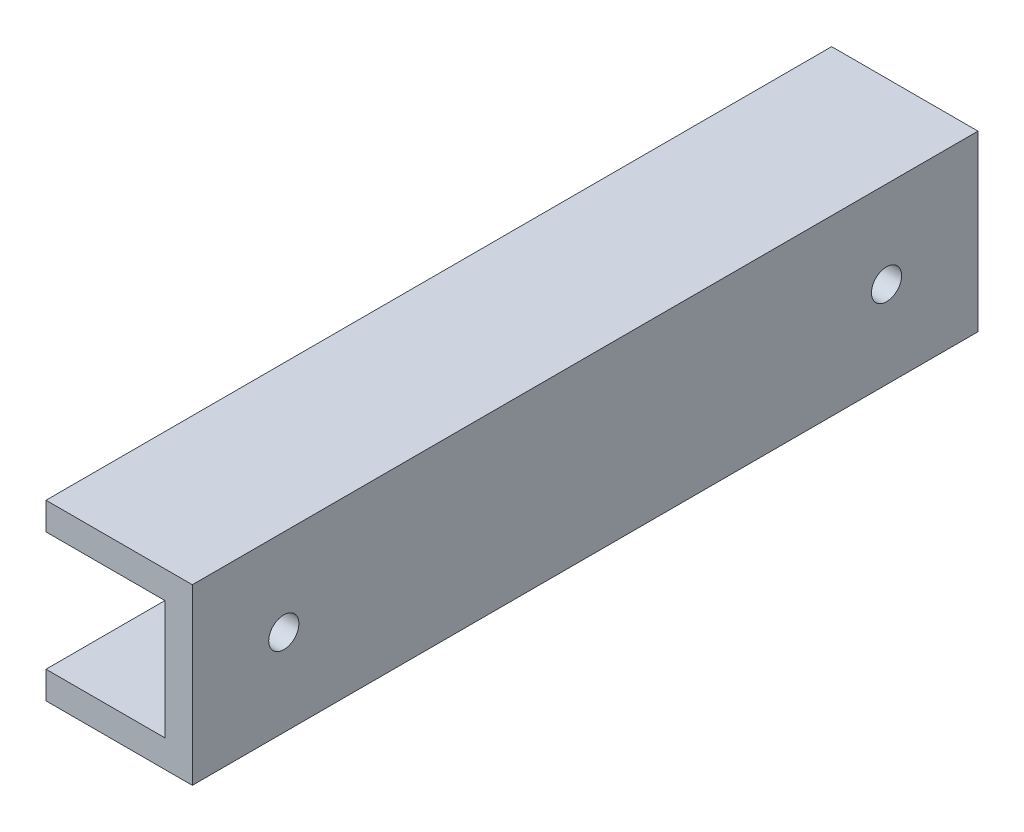
ISO-10303-21;
HEADER;
FILE_DESCRIPTION(('STEP AP214'),'2;1');
FILE_NAME('part.step','',(''),(''),'','','');
FILE_SCHEMA(('AUTOMOTIVE_DESIGN { 1 0 10303 214 1 1 1 1 }'));
ENDSEC;
DATA;
#1=APPLICATION_CONTEXT('core data for automotive mechanical design processes');
#2=APPLICATION_PROTOCOL_DEFINITION('international standard','automotive_design',2000,#1);
#3=PRODUCT_CONTEXT('',#1,'mechanical');
#4=PRODUCT('Part','Part','',(#3));
#5=PRODUCT_RELATED_PRODUCT_CATEGORY('part','',(#4));
#6=PRODUCT_DEFINITION_FORMATION('','',#4);
#7=PRODUCT_DEFINITION_CONTEXT('part definition',#1,'design');
#8=PRODUCT_DEFINITION('design','',#6,#7);
#9=PRODUCT_DEFINITION_SHAPE('','',#8);
#10=(LENGTH_UNIT() NAMED_UNIT(*) SI_UNIT(.MILLI.,.METRE.));
#11=(NAMED_UNIT(*) PLANE_ANGLE_UNIT() SI_UNIT($,.RADIAN.));
#12=(NAMED_UNIT(*) SI_UNIT($,.STERADIAN.) SOLID_ANGLE_UNIT());
#13=UNCERTAINTY_MEASURE_WITH_UNIT(LENGTH_MEASURE(1.E-05),#10,'distance_accuracy_value','');
#14=(GEOMETRIC_REPRESENTATION_CONTEXT(3) GLOBAL_UNCERTAINTY_ASSIGNED_CONTEXT((#13)) GLOBAL_UNIT_ASSIGNED_CONTEXT((#10,
#11,#12)) REPRESENTATION_CONTEXT('',''));
#15=CARTESIAN_POINT('',(0.,0.,0.));
#16=DIRECTION('',(0.,0.,1.));
#17=DIRECTION('',(1.,0.,0.));
#18=AXIS2_PLACEMENT_3D('',#15,#16,#17);
#19=CARTESIAN_POINT('',(3.,13.,23.));
#20=DIRECTION('',(0.,0.,1.));
#21=DIRECTION('',(0.,-1.,0.));
#22=AXIS2_PLACEMENT_3D('',#19,#20,#21);
#23=PLANE('',#22);
#24=DIRECTION('',(1.,0.,0.));
#25=VECTOR('',#24,1.);
#26=CARTESIAN_POINT('',(3.,13.,23.));
#27=LINE('',#26,#25);
#28=CARTESIAN_POINT('',(3.,13.,23.));
#29=VERTEX_POINT('',#28);
#30=CARTESIAN_POINT('',(8.99999999999998,13.,23.));
#31=VERTEX_POINT('',#30);
#32=EDGE_CURVE('E237',#29,#31,#27,.T.);
#33=ORIENTED_EDGE('',*,*,#32,.T.);
#34=DIRECTION('',(0.,-1.,0.));
#35=VECTOR('',#34,1.);
#36=CARTESIAN_POINT('',(8.99999999999998,13.,23.));
#37=LINE('',#36,#35);
#38=CARTESIAN_POINT('',(9.00000000000001,9.,23.));
#39=VERTEX_POINT('',#38);
#40=EDGE_CURVE('E71',#31,#39,#37,.T.);
#41=ORIENTED_EDGE('',*,*,#40,.T.);
#42=DIRECTION('',(-1.,0.,0.));
#43=VECTOR('',#42,1.);
#44=CARTESIAN_POINT('',(6.,9.,23.));
#45=LINE('',#44,#43);
#46=CARTESIAN_POINT('',(3.,9.,23.));
#47=VERTEX_POINT('',#46);
#48=EDGE_CURVE('E352',#39,#47,#45,.T.);
#49=ORIENTED_EDGE('',*,*,#48,.T.);
#50=DIRECTION('',(0.,-1.,0.));
#51=VECTOR('',#50,1.);
#52=CARTESIAN_POINT('',(3.,13.,23.));
#53=LINE('',#52,#51);
#54=EDGE_CURVE('E223',#29,#47,#53,.T.);
#55=ORIENTED_EDGE('',*,*,#54,.F.);
#56=EDGE_LOOP('',(#33,#41,#49,#55));
#57=FACE_BOUND('',#56,.T.);
#58=ADVANCED_FACE('F62',(#57),#23,.F.);
#59=CARTESIAN_POINT('',(3.,13.,62.9));
#60=DIRECTION('',(0.,0.,-1.));
#61=DIRECTION('',(-1.,0.,0.));
#62=AXIS2_PLACEMENT_3D('',#59,#60,#61);
#63=PLANE('',#62);
#64=DIRECTION('',(1.,0.,0.));
#65=VECTOR('',#64,1.);
#66=CARTESIAN_POINT('',(3.,0.,62.9));
#67=LINE('',#66,#65);
#68=CARTESIAN_POINT('',(3.,0.,62.9));
#69=VERTEX_POINT('',#68);
#70=CARTESIAN_POINT('',(8.99999999999998,0.,62.9));
#71=VERTEX_POINT('',#70);
#72=EDGE_CURVE('E224',#69,#71,#67,.T.);
#73=ORIENTED_EDGE('',*,*,#72,.T.);
#74=DIRECTION('',(0.,1.,0.));
#75=VECTOR('',#74,1.);
#76=CARTESIAN_POINT('',(8.99999999999998,13.,62.9));
#77=LINE('',#76,#75);
#78=CARTESIAN_POINT('',(8.99999999999999,4.,62.9));
#79=VERTEX_POINT('',#78);
#80=EDGE_CURVE('E334',#71,#79,#77,.T.);
#81=ORIENTED_EDGE('',*,*,#80,.T.);
#82=DIRECTION('',(-1.,0.,0.));
#83=VECTOR('',#82,1.);
#84=CARTESIAN_POINT('',(6.,4.,62.9));
#85=LINE('',#84,#83);
#86=CARTESIAN_POINT('',(3.,4.,62.9));
#87=VERTEX_POINT('',#86);
#88=EDGE_CURVE('E209',#79,#87,#85,.T.);
#89=ORIENTED_EDGE('',*,*,#88,.T.);
#90=DIRECTION('',(0.,1.,0.));
#91=VECTOR('',#90,1.);
#92=CARTESIAN_POINT('',(3.,13.,62.9));
#93=LINE('',#92,#91);
#94=EDGE_CURVE('E218',#69,#87,#93,.T.);
#95=ORIENTED_EDGE('',*,*,#94,.F.);
#96=EDGE_LOOP('',(#73,#81,#89,#95));
#97=FACE_BOUND('',#96,.T.);
#98=ADVANCED_FACE('F424',(#97),#63,.F.);
#99=CARTESIAN_POINT('',(3.,0.,0.));
#100=DIRECTION('',(-1.,0.,0.));
#101=DIRECTION('',(0.,0.,1.));
#102=AXIS2_PLACEMENT_3D('',#99,#100,#101);
#103=PLANE('',#102);
#104=DIRECTION('',(0.,0.,-1.));
#105=VECTOR('',#104,1.);
#106=CARTESIAN_POINT('',(3.,9.,23.));
#107=LINE('',#106,#105);
#108=CARTESIAN_POINT('',(3.,9.,62.9));
#109=VERTEX_POINT('',#108);
#110=EDGE_CURVE('E219',#109,#47,#107,.T.);
#111=ORIENTED_EDGE('',*,*,#110,.F.);
#112=CARTESIAN_POINT('',(3.,13.,62.9));
#113=VERTEX_POINT('',#112);
#114=EDGE_CURVE('E361',#109,#113,#93,.T.);
#115=ORIENTED_EDGE('',*,*,#114,.T.);
#116=DIRECTION('',(0.,0.,-1.));
#117=VECTOR('',#116,1.);
#118=CARTESIAN_POINT('',(3.,13.,23.));
#119=LINE('',#118,#117);
#120=EDGE_CURVE('E234',#113,#29,#119,.T.);
#121=ORIENTED_EDGE('',*,*,#120,.T.);
#122=ORIENTED_EDGE('',*,*,#54,.T.);
#123=EDGE_LOOP('',(#111,#115,#121,#122));
#124=FACE_BOUND('',#123,.T.);
#125=ADVANCED_FACE('F429',(#124),#103,.T.);
#126=CARTESIAN_POINT('',(0.,0.,85.9));
#127=DIRECTION('',(0.,1.,0.));
#128=DIRECTION('',(0.,0.,1.));
#129=AXIS2_PLACEMENT_3D('',#126,#127,#128);
#130=PLANE('',#129);
#131=DIRECTION('',(0.,0.,-1.));
#132=VECTOR('',#131,1.);
#133=CARTESIAN_POINT('',(13.,0.,85.9));
#134=LINE('',#133,#132);
#135=CARTESIAN_POINT('',(13.,0.,85.9));
#136=VERTEX_POINT('',#135);
#137=CARTESIAN_POINT('',(13.,0.,66.9));
#138=VERTEX_POINT('',#137);
#139=EDGE_CURVE('E285',#136,#138,#134,.T.);
#140=ORIENTED_EDGE('',*,*,#139,.T.);
#141=DIRECTION('',(-0.707106781186551,0.,-0.707106781186544));
#142=VECTOR('',#141,1.);
#143=CARTESIAN_POINT('',(15.9999999999999,0.,69.8999999999999));
#144=LINE('',#143,#142);
#145=EDGE_CURVE('E344',#138,#71,#144,.T.);
#146=ORIENTED_EDGE('',*,*,#145,.T.);
#147=ORIENTED_EDGE('',*,*,#72,.F.);
#148=DIRECTION('',(0.,0.,1.));
#149=VECTOR('',#148,1.);
#150=CARTESIAN_POINT('',(3.,0.,23.));
#151=LINE('',#150,#149);
#152=CARTESIAN_POINT('',(3.,0.,23.));
#153=VERTEX_POINT('',#152);
#154=EDGE_CURVE('E227',#153,#69,#151,.T.);
#155=ORIENTED_EDGE('',*,*,#154,.F.);
#156=DIRECTION('',(1.,0.,0.));
#157=VECTOR('',#156,1.);
#158=CARTESIAN_POINT('',(3.,0.,23.));
#159=LINE('',#158,#157);
#160=CARTESIAN_POINT('',(8.99999999999998,0.,23.));
#161=VERTEX_POINT('',#160);
#162=EDGE_CURVE('E222',#153,#161,#159,.T.);
#163=ORIENTED_EDGE('',*,*,#162,.T.);
#164=DIRECTION('',(0.707106781186551,0.,-0.707106781186544));
#165=VECTOR('',#164,1.);
#166=CARTESIAN_POINT('',(-26.9500000000001,0.,58.9499999999997));
#167=LINE('',#166,#165);
#168=CARTESIAN_POINT('',(13.,0.,19.));
#169=VERTEX_POINT('',#168);
#170=EDGE_CURVE('E78',#161,#169,#167,.T.);
#171=ORIENTED_EDGE('',*,*,#170,.T.);
#172=CARTESIAN_POINT('',(13.,0.,0.));
#173=VERTEX_POINT('',#172);
#174=EDGE_CURVE('E284',#169,#173,#134,.T.);
#175=ORIENTED_EDGE('',*,*,#174,.T.);
#176=DIRECTION('',(1.,0.,0.));
#177=VECTOR('',#176,1.);
#178=CARTESIAN_POINT('',(0.,0.,0.));
#179=LINE('',#178,#177);
#180=CARTESIAN_POINT('',(0.,0.,0.));
#181=VERTEX_POINT('',#180);
#182=EDGE_CURVE('E260',#181,#173,#179,.T.);
#183=ORIENTED_EDGE('',*,*,#182,.F.);
#184=DIRECTION('',(0.,0.,-1.));
#185=VECTOR('',#184,1.);
#186=CARTESIAN_POINT('',(0.,0.,85.9));
#187=LINE('',#186,#185);
#188=CARTESIAN_POINT('',(0.,0.,85.9));
#189=VERTEX_POINT('',#188);
#190=EDGE_CURVE('E288',#189,#181,#187,.T.);
#191=ORIENTED_EDGE('',*,*,#190,.F.);
#192=DIRECTION('',(1.,0.,0.));
#193=VECTOR('',#192,1.);
#194=CARTESIAN_POINT('',(0.,0.,85.9));
#195=LINE('',#194,#193);
#196=EDGE_CURVE('E261',#189,#136,#195,.T.);
#197=ORIENTED_EDGE('',*,*,#196,.T.);
#198=EDGE_LOOP('',(#140,#146,#147,#155,#163,#171,#175,#183,#191,#197));
#199=FACE_BOUND('',#198,.T.);
#200=ADVANCED_FACE('F397',(#199),#130,.T.);
#201=CARTESIAN_POINT('',(13.,0.,85.9));
#202=DIRECTION('',(-1.,0.,0.));
#203=DIRECTION('',(0.,0.,1.));
#204=AXIS2_PLACEMENT_3D('',#201,#202,#203);
#205=PLANE('',#204);
#206=CARTESIAN_POINT('',(13.,6.5,75.9));
#207=DIRECTION('',(-1.,0.,0.));
#208=DIRECTION('',(0.,0.,1.));
#209=AXIS2_PLACEMENT_3D('',#206,#207,#208);
#210=CIRCLE('',#209,1.65);
#211=CARTESIAN_POINT('',(13.,6.5,77.55));
#212=VERTEX_POINT('',#211);
#213=EDGE_CURVE('E248',#212,#212,#210,.T.);
#214=ORIENTED_EDGE('',*,*,#213,.F.);
#215=EDGE_LOOP('',(#214));
#216=FACE_BOUND('',#215,.T.);
#217=DIRECTION('',(0.,0.,-1.));
#218=VECTOR('',#217,1.);
#219=CARTESIAN_POINT('',(13.,13.,85.9));
#220=LINE('',#219,#218);
#221=CARTESIAN_POINT('',(13.,13.,85.9));
#222=VERTEX_POINT('',#221);
#223=CARTESIAN_POINT('',(13.,13.,66.9));
#224=VERTEX_POINT('',#223);
#225=EDGE_CURVE('E281',#222,#224,#220,.T.);
#226=ORIENTED_EDGE('',*,*,#225,.T.);
#227=DIRECTION('',(0.,-1.,0.));
#228=VECTOR('',#227,1.);
#229=CARTESIAN_POINT('',(13.,0.,66.9));
#230=LINE('',#229,#228);
#231=EDGE_CURVE('E341',#224,#138,#230,.T.);
#232=ORIENTED_EDGE('',*,*,#231,.T.);
#233=ORIENTED_EDGE('',*,*,#139,.F.);
#234=DIRECTION('',(0.,1.,0.));
#235=VECTOR('',#234,1.);
#236=CARTESIAN_POINT('',(13.,0.,85.9));
#237=LINE('',#236,#235);
#238=EDGE_CURVE('E263',#136,#222,#237,.T.);
#239=ORIENTED_EDGE('',*,*,#238,.T.);
#240=EDGE_LOOP('',(#226,#232,#233,#239));
#241=FACE_BOUND('',#240,.T.);
#242=ADVANCED_FACE('F395',(#216,#241),#205,.T.);
#243=CARTESIAN_POINT('',(0.,13.,85.9));
#244=DIRECTION('',(0.,-1.,0.));
#245=DIRECTION('',(0.,0.,-1.));
#246=AXIS2_PLACEMENT_3D('',#243,#244,#245);
#247=PLANE('',#246);
#248=DIRECTION('',(1.,0.,0.));
#249=VECTOR('',#248,1.);
#250=CARTESIAN_POINT('',(3.,13.,62.9));
#251=LINE('',#250,#249);
#252=CARTESIAN_POINT('',(8.99999999999998,13.,62.9));
#253=VERTEX_POINT('',#252);
#254=EDGE_CURVE('E229',#113,#253,#251,.T.);
#255=ORIENTED_EDGE('',*,*,#254,.T.);
#256=DIRECTION('',(0.707106781186551,0.,0.707106781186544));
#257=VECTOR('',#256,1.);
#258=CARTESIAN_POINT('',(15.9999999999999,13.,69.8999999999999));
#259=LINE('',#258,#257);
#260=EDGE_CURVE('E339',#253,#224,#259,.T.);
#261=ORIENTED_EDGE('',*,*,#260,.T.);
#262=ORIENTED_EDGE('',*,*,#225,.F.);
#263=DIRECTION('',(-1.,0.,0.));
#264=VECTOR('',#263,1.);
#265=CARTESIAN_POINT('',(0.,13.,85.9));
#266=LINE('',#265,#264);
#267=CARTESIAN_POINT('',(0.,13.,85.9));
#268=VERTEX_POINT('',#267);
#269=EDGE_CURVE('E267',#222,#268,#266,.T.);
#270=ORIENTED_EDGE('',*,*,#269,.T.);
#271=DIRECTION('',(0.,0.,-1.));
#272=VECTOR('',#271,1.);
#273=CARTESIAN_POINT('',(0.,13.,85.9));
#274=LINE('',#273,#272);
#275=CARTESIAN_POINT('',(0.,13.,0.));
#276=VERTEX_POINT('',#275);
#277=EDGE_CURVE('E270',#268,#276,#274,.T.);
#278=ORIENTED_EDGE('',*,*,#277,.T.);
#279=DIRECTION('',(-1.,0.,0.));
#280=VECTOR('',#279,1.);
#281=CARTESIAN_POINT('',(0.,13.,0.));
#282=LINE('',#281,#280);
#283=CARTESIAN_POINT('',(13.,13.,0.));
#284=VERTEX_POINT('',#283);
#285=EDGE_CURVE('E264',#284,#276,#282,.T.);
#286=ORIENTED_EDGE('',*,*,#285,.F.);
#287=CARTESIAN_POINT('',(13.,13.,19.));
#288=VERTEX_POINT('',#287);
#289=EDGE_CURVE('E280',#288,#284,#220,.T.);
#290=ORIENTED_EDGE('',*,*,#289,.F.);
#291=DIRECTION('',(-0.707106781186551,0.,0.707106781186544));
#292=VECTOR('',#291,1.);
#293=CARTESIAN_POINT('',(-26.9500000000001,13.,58.9499999999997));
#294=LINE('',#293,#292);
#295=EDGE_CURVE('E337',#288,#31,#294,.T.);
#296=ORIENTED_EDGE('',*,*,#295,.T.);
#297=ORIENTED_EDGE('',*,*,#32,.F.);
#298=ORIENTED_EDGE('',*,*,#120,.F.);
#299=EDGE_LOOP('',(#255,#261,#262,#270,#278,#286,#290,#296,#297,#298));
#300=FACE_BOUND('',#299,.T.);
#301=ADVANCED_FACE('F384',(#300),#247,.T.);
#302=CARTESIAN_POINT('',(13.,6.5,10.));
#303=DIRECTION('',(-1.,0.,0.));
#304=DIRECTION('',(0.,0.,1.));
#305=AXIS2_PLACEMENT_3D('',#302,#303,#304);
#306=CIRCLE('',#305,1.65);
#307=CARTESIAN_POINT('',(13.,6.5,11.65));
#308=VERTEX_POINT('',#307);
#309=EDGE_CURVE('E256',#308,#308,#306,.T.);
#310=ORIENTED_EDGE('',*,*,#309,.F.);
#311=EDGE_LOOP('',(#310));
#312=FACE_BOUND('',#311,.T.);
#313=ORIENTED_EDGE('',*,*,#174,.F.);
#314=DIRECTION('',(0.,1.,0.));
#315=VECTOR('',#314,1.);
#316=CARTESIAN_POINT('',(13.,0.,19.));
#317=LINE('',#316,#315);
#318=EDGE_CURVE('E12',#169,#288,#317,.T.);
#319=ORIENTED_EDGE('',*,*,#318,.T.);
#320=ORIENTED_EDGE('',*,*,#289,.T.);
#321=DIRECTION('',(0.,1.,0.));
#322=VECTOR('',#321,1.);
#323=CARTESIAN_POINT('',(13.,0.,0.));
#324=LINE('',#323,#322);
#325=EDGE_CURVE('E273',#173,#284,#324,.T.);
#326=ORIENTED_EDGE('',*,*,#325,.F.);
#327=EDGE_LOOP('',(#313,#319,#320,#326));
#328=FACE_BOUND('',#327,.T.);
#329=ADVANCED_FACE('F417',(#312,#328),#205,.T.);
#330=CARTESIAN_POINT('',(0.,0.,85.9));
#331=DIRECTION('',(0.,0.,1.));
#332=DIRECTION('',(1.,0.,0.));
#333=AXIS2_PLACEMENT_3D('',#330,#331,#332);
#334=PLANE('',#333);
#335=DIRECTION('',(-1.,0.,0.));
#336=VECTOR('',#335,1.);
#337=CARTESIAN_POINT('',(0.,16.,85.9));
#338=LINE('',#337,#336);
#339=CARTESIAN_POINT('',(16.,16.,85.9));
#340=VERTEX_POINT('',#339);
#341=CARTESIAN_POINT('',(0.,16.,85.9));
#342=VERTEX_POINT('',#341);
#343=EDGE_CURVE('E296',#340,#342,#338,.T.);
#344=ORIENTED_EDGE('',*,*,#343,.T.);
#345=DIRECTION('',(0.,-1.,0.));
#346=VECTOR('',#345,1.);
#347=CARTESIAN_POINT('',(0.,0.,85.9));
#348=LINE('',#347,#346);
#349=EDGE_CURVE('E244',#342,#268,#348,.T.);
#350=ORIENTED_EDGE('',*,*,#349,.T.);
#351=ORIENTED_EDGE('',*,*,#269,.F.);
#352=ORIENTED_EDGE('',*,*,#238,.F.);
#353=ORIENTED_EDGE('',*,*,#196,.F.);
#354=CARTESIAN_POINT('',(0.,-3.,85.9));
#355=VERTEX_POINT('',#354);
#356=EDGE_CURVE('E249',#189,#355,#348,.T.);
#357=ORIENTED_EDGE('',*,*,#356,.T.);
#358=DIRECTION('',(1.,0.,0.));
#359=VECTOR('',#358,1.);
#360=CARTESIAN_POINT('',(0.,-3.,85.9));
#361=LINE('',#360,#359);
#362=CARTESIAN_POINT('',(16.,-3.,85.9));
#363=VERTEX_POINT('',#362);
#364=EDGE_CURVE('E291',#355,#363,#361,.T.);
#365=ORIENTED_EDGE('',*,*,#364,.T.);
#366=DIRECTION('',(0.,1.,0.));
#367=VECTOR('',#366,1.);
#368=CARTESIAN_POINT('',(16.,0.,85.9));
#369=LINE('',#368,#367);
#370=EDGE_CURVE('E293',#363,#340,#369,.T.);
#371=ORIENTED_EDGE('',*,*,#370,.T.);
#372=EDGE_LOOP('',(#344,#350,#351,#352,#353,#357,#365,#371));
#373=FACE_BOUND('',#372,.T.);
#374=ADVANCED_FACE('F404',(#373),#334,.T.);
#375=CARTESIAN_POINT('',(0.,0.,0.));
#376=DIRECTION('',(0.,0.,1.));
#377=DIRECTION('',(1.,0.,0.));
#378=AXIS2_PLACEMENT_3D('',#375,#376,#377);
#379=PLANE('',#378);
#380=DIRECTION('',(0.,-1.,0.));
#381=VECTOR('',#380,1.);
#382=CARTESIAN_POINT('',(0.,0.,0.));
#383=LINE('',#382,#381);
#384=CARTESIAN_POINT('',(0.,16.,0.));
#385=VERTEX_POINT('',#384);
#386=EDGE_CURVE('E242',#385,#276,#383,.T.);
#387=ORIENTED_EDGE('',*,*,#386,.F.);
#388=DIRECTION('',(-1.,0.,0.));
#389=VECTOR('',#388,1.);
#390=CARTESIAN_POINT('',(0.,16.,0.));
#391=LINE('',#390,#389);
#392=CARTESIAN_POINT('',(16.,16.,0.));
#393=VERTEX_POINT('',#392);
#394=EDGE_CURVE('E294',#393,#385,#391,.T.);
#395=ORIENTED_EDGE('',*,*,#394,.F.);
#396=DIRECTION('',(0.,1.,0.));
#397=VECTOR('',#396,1.);
#398=CARTESIAN_POINT('',(16.,0.,0.));
#399=LINE('',#398,#397);
#400=CARTESIAN_POINT('',(16.,-3.,0.));
#401=VERTEX_POINT('',#400);
#402=EDGE_CURVE('E301',#401,#393,#399,.T.);
#403=ORIENTED_EDGE('',*,*,#402,.F.);
#404=DIRECTION('',(1.,0.,0.));
#405=VECTOR('',#404,1.);
#406=CARTESIAN_POINT('',(0.,-3.,0.));
#407=LINE('',#406,#405);
#408=CARTESIAN_POINT('',(0.,-3.,0.));
#409=VERTEX_POINT('',#408);
#410=EDGE_CURVE('E290',#409,#401,#407,.T.);
#411=ORIENTED_EDGE('',*,*,#410,.F.);
#412=EDGE_CURVE('E241',#181,#409,#383,.T.);
#413=ORIENTED_EDGE('',*,*,#412,.F.);
#414=ORIENTED_EDGE('',*,*,#182,.T.);
#415=ORIENTED_EDGE('',*,*,#325,.T.);
#416=ORIENTED_EDGE('',*,*,#285,.T.);
#417=EDGE_LOOP('',(#387,#395,#403,#411,#413,#414,#415,#416));
#418=FACE_BOUND('',#417,.T.);
#419=ADVANCED_FACE('F412',(#418),#379,.F.);
#420=CARTESIAN_POINT('',(0.,-3.,85.9));
#421=DIRECTION('',(0.,1.,0.));
#422=DIRECTION('',(0.,0.,1.));
#423=AXIS2_PLACEMENT_3D('',#420,#421,#422);
#424=PLANE('',#423);
#425=DIRECTION('',(0.,0.,1.));
#426=VECTOR('',#425,1.);
#427=CARTESIAN_POINT('',(0.,-3.,85.9));
#428=LINE('',#427,#426);
#429=EDGE_CURVE('E250',#409,#355,#428,.T.);
#430=ORIENTED_EDGE('',*,*,#429,.F.);
#431=ORIENTED_EDGE('',*,*,#410,.T.);
#432=DIRECTION('',(0.,0.,-1.));
#433=VECTOR('',#432,1.);
#434=CARTESIAN_POINT('',(16.,-3.,85.9));
#435=LINE('',#434,#433);
#436=EDGE_CURVE('E307',#363,#401,#435,.T.);
#437=ORIENTED_EDGE('',*,*,#436,.F.);
#438=ORIENTED_EDGE('',*,*,#364,.F.);
#439=EDGE_LOOP('',(#430,#431,#437,#438));
#440=FACE_BOUND('',#439,.T.);
#441=ADVANCED_FACE('F467',(#440),#424,.F.);
#442=CARTESIAN_POINT('',(0.,16.,85.9));
#443=DIRECTION('',(0.,-1.,0.));
#444=DIRECTION('',(0.,0.,-1.));
#445=AXIS2_PLACEMENT_3D('',#442,#443,#444);
#446=PLANE('',#445);
#447=DIRECTION('',(0.,0.,-1.));
#448=VECTOR('',#447,1.);
#449=CARTESIAN_POINT('',(0.,16.,85.9));
#450=LINE('',#449,#448);
#451=EDGE_CURVE('E245',#342,#385,#450,.T.);
#452=ORIENTED_EDGE('',*,*,#451,.F.);
#453=ORIENTED_EDGE('',*,*,#343,.F.);
#454=DIRECTION('',(0.,0.,-1.));
#455=VECTOR('',#454,1.);
#456=CARTESIAN_POINT('',(16.,16.,85.9));
#457=LINE('',#456,#455);
#458=EDGE_CURVE('E299',#340,#393,#457,.T.);
#459=ORIENTED_EDGE('',*,*,#458,.T.);
#460=ORIENTED_EDGE('',*,*,#394,.T.);
#461=EDGE_LOOP('',(#452,#453,#459,#460));
#462=FACE_BOUND('',#461,.T.);
#463=ADVANCED_FACE('F468',(#462),#446,.F.);
#464=CARTESIAN_POINT('',(16.,0.,85.9));
#465=DIRECTION('',(-1.,0.,0.));
#466=DIRECTION('',(0.,0.,1.));
#467=AXIS2_PLACEMENT_3D('',#464,#465,#466);
#468=PLANE('',#467);
#469=CARTESIAN_POINT('',(16.,6.5,10.));
#470=DIRECTION('',(-1.,0.,0.));
#471=DIRECTION('',(0.,0.,1.));
#472=AXIS2_PLACEMENT_3D('',#469,#470,#471);
#473=CIRCLE('',#472,1.65);
#474=CARTESIAN_POINT('',(16.,6.5,11.65));
#475=VERTEX_POINT('',#474);
#476=EDGE_CURVE('E257',#475,#475,#473,.T.);
#477=ORIENTED_EDGE('',*,*,#476,.T.);
#478=EDGE_LOOP('',(#477));
#479=FACE_BOUND('',#478,.T.);
#480=CARTESIAN_POINT('',(16.,6.5,75.9));
#481=DIRECTION('',(-1.,0.,0.));
#482=DIRECTION('',(0.,0.,1.));
#483=AXIS2_PLACEMENT_3D('',#480,#481,#482);
#484=CIRCLE('',#483,1.65);
#485=CARTESIAN_POINT('',(16.,6.5,77.55));
#486=VERTEX_POINT('',#485);
#487=EDGE_CURVE('E253',#486,#486,#484,.T.);
#488=ORIENTED_EDGE('',*,*,#487,.T.);
#489=EDGE_LOOP('',(#488));
#490=FACE_BOUND('',#489,.T.);
#491=ORIENTED_EDGE('',*,*,#402,.T.);
#492=ORIENTED_EDGE('',*,*,#458,.F.);
#493=ORIENTED_EDGE('',*,*,#370,.F.);
#494=ORIENTED_EDGE('',*,*,#436,.T.);
#495=EDGE_LOOP('',(#491,#492,#493,#494));
#496=FACE_BOUND('',#495,.T.);
#497=ADVANCED_FACE('F454',(#479,#490,#496),#468,.F.);
#498=CARTESIAN_POINT('',(27.,6.5,75.9));
#499=DIRECTION('',(-1.,0.,0.));
#500=DIRECTION('',(0.,0.,1.));
#501=AXIS2_PLACEMENT_3D('',#498,#499,#500);
#502=CYLINDRICAL_SURFACE('',#501,1.65);
#503=CARTESIAN_POINT('',(13.,6.5,77.55));
#504=CARTESIAN_POINT('',(13.03125,6.5,77.55));
#505=CARTESIAN_POINT('',(13.0625,6.5,77.55));
#506=CARTESIAN_POINT('',(13.125,6.5,77.55));
#507=CARTESIAN_POINT('',(13.15625,6.5,77.55));
#508=CARTESIAN_POINT('',(13.21875,6.5,77.55));
#509=CARTESIAN_POINT('',(13.25,6.5,77.55));
#510=CARTESIAN_POINT('',(13.3125,6.5,77.55));
#511=CARTESIAN_POINT('',(13.34375,6.5,77.55));
#512=CARTESIAN_POINT('',(13.40625,6.5,77.55));
#513=CARTESIAN_POINT('',(13.4375,6.5,77.55));
#514=CARTESIAN_POINT('',(13.5,6.5,77.55));
#515=CARTESIAN_POINT('',(13.53125,6.5,77.55));
#516=CARTESIAN_POINT('',(13.59375,6.5,77.55));
#517=CARTESIAN_POINT('',(13.625,6.5,77.55));
#518=CARTESIAN_POINT('',(13.6875,6.5,77.55));
#519=CARTESIAN_POINT('',(13.71875,6.5,77.55));
#520=CARTESIAN_POINT('',(13.78125,6.5,77.55));
#521=CARTESIAN_POINT('',(13.8125,6.5,77.55));
#522=CARTESIAN_POINT('',(13.875,6.5,77.55));
#523=CARTESIAN_POINT('',(13.90625,6.5,77.55));
#524=CARTESIAN_POINT('',(13.96875,6.5,77.55));
#525=CARTESIAN_POINT('',(14.,6.5,77.55));
#526=CARTESIAN_POINT('',(14.0625,6.5,77.55));
#527=CARTESIAN_POINT('',(14.09375,6.5,77.55));
#528=CARTESIAN_POINT('',(14.15625,6.5,77.55));
#529=CARTESIAN_POINT('',(14.1875,6.5,77.55));
#530=CARTESIAN_POINT('',(14.25,6.5,77.55));
#531=CARTESIAN_POINT('',(14.28125,6.5,77.55));
#532=CARTESIAN_POINT('',(14.34375,6.5,77.55));
#533=CARTESIAN_POINT('',(14.375,6.5,77.55));
#534=CARTESIAN_POINT('',(14.4375,6.5,77.55));
#535=CARTESIAN_POINT('',(14.46875,6.5,77.55));
#536=CARTESIAN_POINT('',(14.53125,6.5,77.55));
#537=CARTESIAN_POINT('',(14.5625,6.5,77.55));
#538=CARTESIAN_POINT('',(14.625,6.5,77.55));
#539=CARTESIAN_POINT('',(14.65625,6.5,77.55));
#540=CARTESIAN_POINT('',(14.71875,6.5,77.55));
#541=CARTESIAN_POINT('',(14.75,6.5,77.55));
#542=CARTESIAN_POINT('',(14.8125,6.5,77.55));
#543=CARTESIAN_POINT('',(14.84375,6.5,77.55));
#544=CARTESIAN_POINT('',(14.90625,6.5,77.55));
#545=CARTESIAN_POINT('',(14.9375,6.5,77.55));
#546=CARTESIAN_POINT('',(15.,6.5,77.55));
#547=CARTESIAN_POINT('',(15.03125,6.5,77.55));
#548=CARTESIAN_POINT('',(15.09375,6.5,77.55));
#549=CARTESIAN_POINT('',(15.125,6.5,77.55));
#550=CARTESIAN_POINT('',(15.1875,6.5,77.55));
#551=CARTESIAN_POINT('',(15.21875,6.5,77.55));
#552=CARTESIAN_POINT('',(15.28125,6.5,77.55));
#553=CARTESIAN_POINT('',(15.3125,6.5,77.55));
#554=CARTESIAN_POINT('',(15.375,6.5,77.55));
#555=CARTESIAN_POINT('',(15.40625,6.5,77.55));
#556=CARTESIAN_POINT('',(15.46875,6.5,77.55));
#557=CARTESIAN_POINT('',(15.5,6.5,77.55));
#558=CARTESIAN_POINT('',(15.5625,6.5,77.55));
#559=CARTESIAN_POINT('',(15.59375,6.5,77.55));
#560=CARTESIAN_POINT('',(15.65625,6.5,77.55));
#561=CARTESIAN_POINT('',(15.6875,6.5,77.55));
#562=CARTESIAN_POINT('',(15.75,6.5,77.55));
#563=CARTESIAN_POINT('',(15.78125,6.5,77.55));
#564=CARTESIAN_POINT('',(15.84375,6.5,77.55));
#565=CARTESIAN_POINT('',(15.875,6.5,77.55));
#566=CARTESIAN_POINT('',(15.9375,6.5,77.55));
#567=CARTESIAN_POINT('',(15.96875,6.5,77.55));
#568=CARTESIAN_POINT('',(16.,6.5,77.55));
#569=B_SPLINE_CURVE_WITH_KNOTS('',3,(#503,#504,#505,#506,#507,#508,#509,#510,#511,#512,#513,
#514,#515,#516,#517,#518,#519,#520,#521,#522,#523,#524,#525,#526,#527,#528,#529,#530,#531,#532,
#533,#534,#535,#536,#537,#538,#539,#540,#541,#542,#543,#544,#545,#546,#547,#548,#549,#550,#551,
#552,#553,#554,#555,#556,#557,#558,#559,#560,#561,#562,#563,#564,#565,#566,#567,#568),
.UNSPECIFIED.,.F.,.F.,(4,2,2,2,2,2,2,2,2,2,2,2,2,2,2,2,2,2,2,2,2,2,2,2,2,2,2,2,2,2,2,2,4),(0.,
0.0937500000000001,0.1875,0.28125,0.375,0.46875,0.5625,0.656250000000001,0.750000000000001,
0.843749999999999,0.937499999999999,1.03125,1.125,1.21875,1.3125,1.40625,1.5,1.59375,1.6875,
1.78125,1.875,1.96875,2.0625,2.15625,2.25,2.34375,2.4375,2.53125,2.625,2.71875,2.8125,2.90625,
3.),.UNSPECIFIED.);
#570=EDGE_CURVE('BSEAM450',#212,#486,#569,.T.);
#571=ORIENTED_EDGE('',*,*,#213,.T.);
#572=ORIENTED_EDGE('',*,*,#487,.F.);
#573=ORIENTED_EDGE('',*,*,#570,.T.);
#574=ORIENTED_EDGE('',*,*,#570,.F.);
#575=EDGE_LOOP('',(#571,#573,#572,#574));
#576=FACE_BOUND('',#575,.T.);
#577=ADVANCED_FACE('F450',(#576),#502,.F.);
#578=CARTESIAN_POINT('',(27.,6.5,10.));
#579=DIRECTION('',(-1.,0.,0.));
#580=DIRECTION('',(0.,0.,1.));
#581=AXIS2_PLACEMENT_3D('',#578,#579,#580);
#582=CYLINDRICAL_SURFACE('',#581,1.65);
#583=CARTESIAN_POINT('',(13.,6.5,11.65));
#584=CARTESIAN_POINT('',(13.03125,6.5,11.65));
#585=CARTESIAN_POINT('',(13.0625,6.5,11.65));
#586=CARTESIAN_POINT('',(13.125,6.5,11.65));
#587=CARTESIAN_POINT('',(13.15625,6.5,11.65));
#588=CARTESIAN_POINT('',(13.21875,6.5,11.65));
#589=CARTESIAN_POINT('',(13.25,6.5,11.65));
#590=CARTESIAN_POINT('',(13.3125,6.5,11.65));
#591=CARTESIAN_POINT('',(13.34375,6.5,11.65));
#592=CARTESIAN_POINT('',(13.40625,6.5,11.65));
#593=CARTESIAN_POINT('',(13.4375,6.5,11.65));
#594=CARTESIAN_POINT('',(13.5,6.5,11.65));
#595=CARTESIAN_POINT('',(13.53125,6.5,11.65));
#596=CARTESIAN_POINT('',(13.59375,6.5,11.65));
#597=CARTESIAN_POINT('',(13.625,6.5,11.65));
#598=CARTESIAN_POINT('',(13.6875,6.5,11.65));
#599=CARTESIAN_POINT('',(13.71875,6.5,11.65));
#600=CARTESIAN_POINT('',(13.78125,6.5,11.65));
#601=CARTESIAN_POINT('',(13.8125,6.5,11.65));
#602=CARTESIAN_POINT('',(13.875,6.5,11.65));
#603=CARTESIAN_POINT('',(13.90625,6.5,11.65));
#604=CARTESIAN_POINT('',(13.96875,6.5,11.65));
#605=CARTESIAN_POINT('',(14.,6.5,11.65));
#606=CARTESIAN_POINT('',(14.0625,6.5,11.65));
#607=CARTESIAN_POINT('',(14.09375,6.5,11.65));
#608=CARTESIAN_POINT('',(14.15625,6.5,11.65));
#609=CARTESIAN_POINT('',(14.1875,6.5,11.65));
#610=CARTESIAN_POINT('',(14.25,6.5,11.65));
#611=CARTESIAN_POINT('',(14.28125,6.5,11.65));
#612=CARTESIAN_POINT('',(14.34375,6.5,11.65));
#613=CARTESIAN_POINT('',(14.375,6.5,11.65));
#614=CARTESIAN_POINT('',(14.4375,6.5,11.65));
#615=CARTESIAN_POINT('',(14.46875,6.5,11.65));
#616=CARTESIAN_POINT('',(14.53125,6.5,11.65));
#617=CARTESIAN_POINT('',(14.5625,6.5,11.65));
#618=CARTESIAN_POINT('',(14.625,6.5,11.65));
#619=CARTESIAN_POINT('',(14.65625,6.5,11.65));
#620=CARTESIAN_POINT('',(14.71875,6.5,11.65));
#621=CARTESIAN_POINT('',(14.75,6.5,11.65));
#622=CARTESIAN_POINT('',(14.8125,6.5,11.65));
#623=CARTESIAN_POINT('',(14.84375,6.5,11.65));
#624=CARTESIAN_POINT('',(14.90625,6.5,11.65));
#625=CARTESIAN_POINT('',(14.9375,6.5,11.65));
#626=CARTESIAN_POINT('',(15.,6.5,11.65));
#627=CARTESIAN_POINT('',(15.03125,6.5,11.65));
#628=CARTESIAN_POINT('',(15.09375,6.5,11.65));
#629=CARTESIAN_POINT('',(15.125,6.5,11.65));
#630=CARTESIAN_POINT('',(15.1875,6.5,11.65));
#631=CARTESIAN_POINT('',(15.21875,6.5,11.65));
#632=CARTESIAN_POINT('',(15.28125,6.5,11.65));
#633=CARTESIAN_POINT('',(15.3125,6.5,11.65));
#634=CARTESIAN_POINT('',(15.375,6.5,11.65));
#635=CARTESIAN_POINT('',(15.40625,6.5,11.65));
#636=CARTESIAN_POINT('',(15.46875,6.5,11.65));
#637=CARTESIAN_POINT('',(15.5,6.5,11.65));
#638=CARTESIAN_POINT('',(15.5625,6.5,11.65));
#639=CARTESIAN_POINT('',(15.59375,6.5,11.65));
#640=CARTESIAN_POINT('',(15.65625,6.5,11.65));
#641=CARTESIAN_POINT('',(15.6875,6.5,11.65));
#642=CARTESIAN_POINT('',(15.75,6.5,11.65));
#643=CARTESIAN_POINT('',(15.78125,6.5,11.65));
#644=CARTESIAN_POINT('',(15.84375,6.5,11.65));
#645=CARTESIAN_POINT('',(15.875,6.5,11.65));
#646=CARTESIAN_POINT('',(15.9375,6.5,11.65));
#647=CARTESIAN_POINT('',(15.96875,6.5,11.65));
#648=CARTESIAN_POINT('',(16.,6.5,11.65));
#649=B_SPLINE_CURVE_WITH_KNOTS('',3,(#583,#584,#585,#586,#587,#588,#589,#590,#591,#592,#593,
#594,#595,#596,#597,#598,#599,#600,#601,#602,#603,#604,#605,#606,#607,#608,#609,#610,#611,#612,
#613,#614,#615,#616,#617,#618,#619,#620,#621,#622,#623,#624,#625,#626,#627,#628,#629,#630,#631,
#632,#633,#634,#635,#636,#637,#638,#639,#640,#641,#642,#643,#644,#645,#646,#647,#648),
.UNSPECIFIED.,.F.,.F.,(4,2,2,2,2,2,2,2,2,2,2,2,2,2,2,2,2,2,2,2,2,2,2,2,2,2,2,2,2,2,2,2,4),(0.,
0.0937500000000001,0.1875,0.28125,0.375,0.46875,0.5625,0.656250000000001,0.750000000000001,
0.843749999999999,0.937499999999999,1.03125,1.125,1.21875,1.3125,1.40625,1.5,1.59375,1.6875,
1.78125,1.875,1.96875,2.0625,2.15625,2.25,2.34375,2.4375,2.53125,2.625,2.71875,2.8125,2.90625,
3.),.UNSPECIFIED.);
#650=EDGE_CURVE('BSEAM446',#308,#475,#649,.T.);
#651=ORIENTED_EDGE('',*,*,#309,.T.);
#652=ORIENTED_EDGE('',*,*,#476,.F.);
#653=ORIENTED_EDGE('',*,*,#650,.T.);
#654=ORIENTED_EDGE('',*,*,#650,.F.);
#655=EDGE_LOOP('',(#651,#653,#652,#654));
#656=FACE_BOUND('',#655,.T.);
#657=ADVANCED_FACE('F446',(#656),#582,.F.);
#658=CARTESIAN_POINT('',(0.,0.,0.));
#659=DIRECTION('',(-1.,0.,0.));
#660=DIRECTION('',(0.,0.,1.));
#661=AXIS2_PLACEMENT_3D('',#658,#659,#660);
#662=PLANE('',#661);
#663=ORIENTED_EDGE('',*,*,#451,.T.);
#664=ORIENTED_EDGE('',*,*,#386,.T.);
#665=ORIENTED_EDGE('',*,*,#277,.F.);
#666=ORIENTED_EDGE('',*,*,#349,.F.);
#667=EDGE_LOOP('',(#663,#664,#665,#666));
#668=FACE_BOUND('',#667,.T.);
#669=ADVANCED_FACE('F441',(#668),#662,.T.);
#670=ORIENTED_EDGE('',*,*,#429,.T.);
#671=ORIENTED_EDGE('',*,*,#356,.F.);
#672=ORIENTED_EDGE('',*,*,#190,.T.);
#673=ORIENTED_EDGE('',*,*,#412,.T.);
#674=EDGE_LOOP('',(#670,#671,#672,#673));
#675=FACE_BOUND('',#674,.T.);
#676=ADVANCED_FACE('F436',(#675),#662,.T.);
#677=DIRECTION('',(-1.,0.,0.));
#678=VECTOR('',#677,1.);
#679=CARTESIAN_POINT('',(6.,4.,23.));
#680=LINE('',#679,#678);
#681=CARTESIAN_POINT('',(9.00000000000001,4.,23.));
#682=VERTEX_POINT('',#681);
#683=CARTESIAN_POINT('',(3.,4.,23.));
#684=VERTEX_POINT('',#683);
#685=EDGE_CURVE('E199',#682,#684,#680,.T.);
#686=ORIENTED_EDGE('',*,*,#685,.F.);
#687=DIRECTION('',(0.,-1.,0.));
#688=VECTOR('',#687,1.);
#689=CARTESIAN_POINT('',(8.99999999999998,13.,23.));
#690=LINE('',#689,#688);
#691=EDGE_CURVE('E86',#682,#161,#690,.T.);
#692=ORIENTED_EDGE('',*,*,#691,.T.);
#693=ORIENTED_EDGE('',*,*,#162,.F.);
#694=EDGE_CURVE('E215',#684,#153,#53,.T.);
#695=ORIENTED_EDGE('',*,*,#694,.F.);
#696=EDGE_LOOP('',(#686,#692,#693,#695));
#697=FACE_BOUND('',#696,.T.);
#698=ADVANCED_FACE('F221',(#697),#23,.F.);
#699=DIRECTION('',(0.,0.,1.));
#700=VECTOR('',#699,1.);
#701=CARTESIAN_POINT('',(3.,4.,23.));
#702=LINE('',#701,#700);
#703=EDGE_CURVE('E203',#684,#87,#702,.T.);
#704=ORIENTED_EDGE('',*,*,#703,.F.);
#705=ORIENTED_EDGE('',*,*,#694,.T.);
#706=ORIENTED_EDGE('',*,*,#154,.T.);
#707=ORIENTED_EDGE('',*,*,#94,.T.);
#708=EDGE_LOOP('',(#704,#705,#706,#707));
#709=FACE_BOUND('',#708,.T.);
#710=ADVANCED_FACE('F214',(#709),#103,.T.);
#711=DIRECTION('',(-1.,0.,0.));
#712=VECTOR('',#711,1.);
#713=CARTESIAN_POINT('',(6.,9.,62.9));
#714=LINE('',#713,#712);
#715=CARTESIAN_POINT('',(8.99999999999999,9.,62.9));
#716=VERTEX_POINT('',#715);
#717=EDGE_CURVE('E362',#716,#109,#714,.T.);
#718=ORIENTED_EDGE('',*,*,#717,.F.);
#719=DIRECTION('',(0.,1.,0.));
#720=VECTOR('',#719,1.);
#721=CARTESIAN_POINT('',(8.99999999999998,13.,62.9));
#722=LINE('',#721,#720);
#723=EDGE_CURVE('E332',#716,#253,#722,.T.);
#724=ORIENTED_EDGE('',*,*,#723,.T.);
#725=ORIENTED_EDGE('',*,*,#254,.F.);
#726=ORIENTED_EDGE('',*,*,#114,.F.);
#727=EDGE_LOOP('',(#718,#724,#725,#726));
#728=FACE_BOUND('',#727,.T.);
#729=ADVANCED_FACE('F432',(#728),#63,.F.);
#730=CARTESIAN_POINT('',(6.,9.,23.));
#731=DIRECTION('',(0.,1.,0.));
#732=DIRECTION('',(0.,0.,1.));
#733=AXIS2_PLACEMENT_3D('',#730,#731,#732);
#734=PLANE('',#733);
#735=ORIENTED_EDGE('',*,*,#110,.T.);
#736=ORIENTED_EDGE('',*,*,#48,.F.);
#737=DIRECTION('',(-0.707106781186549,0.,0.707106781186546));
#738=VECTOR('',#737,1.);
#739=CARTESIAN_POINT('',(7.5,9.,24.5));
#740=LINE('',#739,#738);
#741=CARTESIAN_POINT('',(6.,9.,26.));
#742=VERTEX_POINT('',#741);
#743=EDGE_CURVE('E330',#39,#742,#740,.T.);
#744=ORIENTED_EDGE('',*,*,#743,.T.);
#745=DIRECTION('',(0.,0.,-1.));
#746=VECTOR('',#745,1.);
#747=CARTESIAN_POINT('',(6.,9.,23.));
#748=LINE('',#747,#746);
#749=CARTESIAN_POINT('',(6.,9.,59.9));
#750=VERTEX_POINT('',#749);
#751=EDGE_CURVE('E210',#750,#742,#748,.T.);
#752=ORIENTED_EDGE('',*,*,#751,.F.);
#753=DIRECTION('',(0.707106781186551,0.,0.707106781186544));
#754=VECTOR('',#753,1.);
#755=CARTESIAN_POINT('',(-12.45,9.,41.4500000000002));
#756=LINE('',#755,#754);
#757=EDGE_CURVE('E324',#750,#716,#756,.T.);
#758=ORIENTED_EDGE('',*,*,#757,.T.);
#759=ORIENTED_EDGE('',*,*,#717,.T.);
#760=EDGE_LOOP('',(#735,#736,#744,#752,#758,#759));
#761=FACE_BOUND('',#760,.T.);
#762=ADVANCED_FACE('F357',(#761),#734,.F.);
#763=CARTESIAN_POINT('',(6.,4.,23.));
#764=DIRECTION('',(0.,-1.,0.));
#765=DIRECTION('',(0.,0.,-1.));
#766=AXIS2_PLACEMENT_3D('',#763,#764,#765);
#767=PLANE('',#766);
#768=ORIENTED_EDGE('',*,*,#703,.T.);
#769=ORIENTED_EDGE('',*,*,#88,.F.);
#770=DIRECTION('',(-0.707106781186551,0.,-0.707106781186544));
#771=VECTOR('',#770,1.);
#772=CARTESIAN_POINT('',(-12.45,4.,41.4500000000002));
#773=LINE('',#772,#771);
#774=CARTESIAN_POINT('',(6.,4.,59.9));
#775=VERTEX_POINT('',#774);
#776=EDGE_CURVE('E327',#79,#775,#773,.T.);
#777=ORIENTED_EDGE('',*,*,#776,.T.);
#778=DIRECTION('',(0.,0.,1.));
#779=VECTOR('',#778,1.);
#780=CARTESIAN_POINT('',(6.,4.,23.));
#781=LINE('',#780,#779);
#782=CARTESIAN_POINT('',(6.,4.,26.));
#783=VERTEX_POINT('',#782);
#784=EDGE_CURVE('E370',#783,#775,#781,.T.);
#785=ORIENTED_EDGE('',*,*,#784,.F.);
#786=DIRECTION('',(0.707106781186549,0.,-0.707106781186546));
#787=VECTOR('',#786,1.);
#788=CARTESIAN_POINT('',(7.5,4.,24.5));
#789=LINE('',#788,#787);
#790=EDGE_CURVE('E206',#783,#682,#789,.T.);
#791=ORIENTED_EDGE('',*,*,#790,.T.);
#792=ORIENTED_EDGE('',*,*,#685,.T.);
#793=EDGE_LOOP('',(#768,#769,#777,#785,#791,#792));
#794=FACE_BOUND('',#793,.T.);
#795=ADVANCED_FACE('F201',(#794),#767,.F.);
#796=CARTESIAN_POINT('',(6.,0.,0.));
#797=DIRECTION('',(-1.,0.,0.));
#798=DIRECTION('',(0.,0.,1.));
#799=AXIS2_PLACEMENT_3D('',#796,#797,#798);
#800=PLANE('',#799);
#801=ORIENTED_EDGE('',*,*,#784,.T.);
#802=DIRECTION('',(0.,1.,0.));
#803=VECTOR('',#802,1.);
#804=CARTESIAN_POINT('',(6.,9.,59.9));
#805=LINE('',#804,#803);
#806=EDGE_CURVE('E317',#775,#750,#805,.T.);
#807=ORIENTED_EDGE('',*,*,#806,.T.);
#808=ORIENTED_EDGE('',*,*,#751,.T.);
#809=DIRECTION('',(0.,-1.,0.));
#810=VECTOR('',#809,1.);
#811=CARTESIAN_POINT('',(6.,4.,26.));
#812=LINE('',#811,#810);
#813=EDGE_CURVE('E310',#742,#783,#812,.T.);
#814=ORIENTED_EDGE('',*,*,#813,.T.);
#815=EDGE_LOOP('',(#801,#807,#808,#814));
#816=FACE_BOUND('',#815,.T.);
#817=ADVANCED_FACE('F369',(#816),#800,.T.);
#818=CARTESIAN_POINT('',(6.,0.,59.9));
#819=DIRECTION('',(-0.707106781186544,0.,0.707106781186551));
#820=DIRECTION('',(0.,-1.,0.));
#821=AXIS2_PLACEMENT_3D('',#818,#819,#820);
#822=PLANE('',#821);
#823=ORIENTED_EDGE('',*,*,#776,.F.);
#824=DIRECTION('',(0.,-1.,0.));
#825=VECTOR('',#824,1.);
#826=CARTESIAN_POINT('',(8.99999999999999,4.,62.9));
#827=LINE('',#826,#825);
#828=EDGE_CURVE('E320',#716,#79,#827,.T.);
#829=ORIENTED_EDGE('',*,*,#828,.F.);
#830=ORIENTED_EDGE('',*,*,#757,.F.);
#831=ORIENTED_EDGE('',*,*,#806,.F.);
#832=EDGE_LOOP('',(#823,#829,#830,#831));
#833=FACE_BOUND('',#832,.T.);
#834=ADVANCED_FACE('F479',(#833),#822,.T.);
#835=CARTESIAN_POINT('',(6.,0.,26.));
#836=DIRECTION('',(-0.707106781186546,0.,-0.707106781186549));
#837=DIRECTION('',(0.,1.,0.));
#838=AXIS2_PLACEMENT_3D('',#835,#836,#837);
#839=PLANE('',#838);
#840=ORIENTED_EDGE('',*,*,#743,.F.);
#841=DIRECTION('',(0.,1.,0.));
#842=VECTOR('',#841,1.);
#843=CARTESIAN_POINT('',(9.00000000000001,9.,23.));
#844=LINE('',#843,#842);
#845=EDGE_CURVE('E322',#682,#39,#844,.T.);
#846=ORIENTED_EDGE('',*,*,#845,.F.);
#847=ORIENTED_EDGE('',*,*,#790,.F.);
#848=ORIENTED_EDGE('',*,*,#813,.F.);
#849=EDGE_LOOP('',(#840,#846,#847,#848));
#850=FACE_BOUND('',#849,.T.);
#851=ADVANCED_FACE('F366',(#850),#839,.T.);
#852=CARTESIAN_POINT('',(8.99999999999998,13.,62.9));
#853=DIRECTION('',(0.707106781186544,0.,-0.707106781186551));
#854=DIRECTION('',(0.,1.,0.));
#855=AXIS2_PLACEMENT_3D('',#852,#853,#854);
#856=PLANE('',#855);
#857=ORIENTED_EDGE('',*,*,#145,.F.);
#858=ORIENTED_EDGE('',*,*,#231,.F.);
#859=ORIENTED_EDGE('',*,*,#260,.F.);
#860=ORIENTED_EDGE('',*,*,#723,.F.);
#861=ORIENTED_EDGE('',*,*,#828,.T.);
#862=ORIENTED_EDGE('',*,*,#80,.F.);
#863=EDGE_LOOP('',(#857,#858,#859,#860,#861,#862));
#864=FACE_BOUND('',#863,.T.);
#865=ADVANCED_FACE('F391',(#864),#856,.F.);
#866=CARTESIAN_POINT('',(8.99999999999998,13.,23.));
#867=DIRECTION('',(0.707106781186544,0.,0.707106781186551));
#868=DIRECTION('',(0.,-1.,0.));
#869=AXIS2_PLACEMENT_3D('',#866,#867,#868);
#870=PLANE('',#869);
#871=ORIENTED_EDGE('',*,*,#295,.F.);
#872=ORIENTED_EDGE('',*,*,#318,.F.);
#873=ORIENTED_EDGE('',*,*,#170,.F.);
#874=ORIENTED_EDGE('',*,*,#691,.F.);
#875=ORIENTED_EDGE('',*,*,#845,.T.);
#876=ORIENTED_EDGE('',*,*,#40,.F.);
#877=EDGE_LOOP('',(#871,#872,#873,#874,#875,#876));
#878=FACE_BOUND('',#877,.T.);
#879=ADVANCED_FACE('F65',(#878),#870,.F.);
#880=CLOSED_SHELL('',(#58,#98,#125,#200,#242,#301,#329,#374,#419,#441,#463,#497,#577,#657,#669,
#676,#698,#710,#729,#762,#795,#817,#834,#851,#865,#879));
#881=MANIFOLD_SOLID_BREP('B2',#880);
#882=ADVANCED_BREP_SHAPE_REPRESENTATION('',(#18,#881),#14);
#883=SHAPE_DEFINITION_REPRESENTATION(#9,#882);
ENDSEC;
END-ISO-10303-21;
